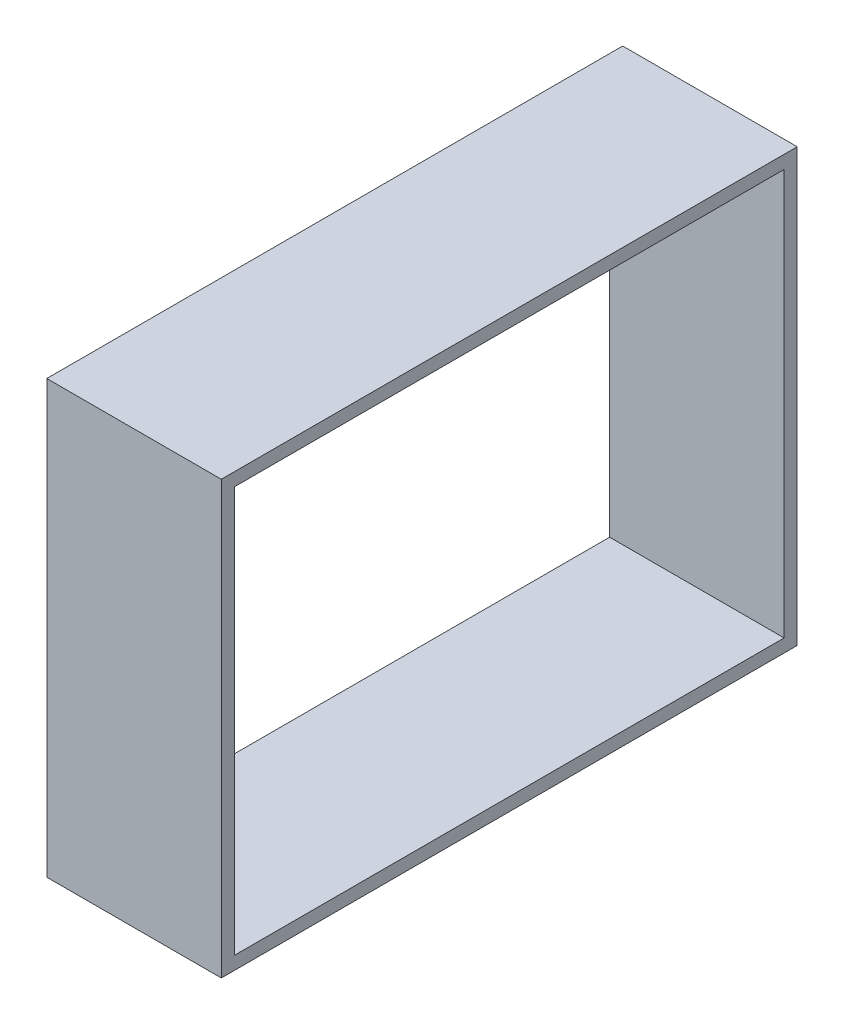
ISO-10303-21;
HEADER;
FILE_DESCRIPTION(('STEP AP214'),'2;1');
FILE_NAME('part.step','',(''),(''),'','','');
FILE_SCHEMA(('AUTOMOTIVE_DESIGN { 1 0 10303 214 1 1 1 1 }'));
ENDSEC;
DATA;
#1=APPLICATION_CONTEXT('core data for automotive mechanical design processes');
#2=APPLICATION_PROTOCOL_DEFINITION('international standard','automotive_design',2000,#1);
#3=PRODUCT_CONTEXT('',#1,'mechanical');
#4=PRODUCT('Part','Part','',(#3));
#5=PRODUCT_RELATED_PRODUCT_CATEGORY('part','',(#4));
#6=PRODUCT_DEFINITION_FORMATION('','',#4);
#7=PRODUCT_DEFINITION_CONTEXT('part definition',#1,'design');
#8=PRODUCT_DEFINITION('design','',#6,#7);
#9=PRODUCT_DEFINITION_SHAPE('','',#8);
#10=(LENGTH_UNIT() NAMED_UNIT(*) SI_UNIT(.MILLI.,.METRE.));
#11=(NAMED_UNIT(*) PLANE_ANGLE_UNIT() SI_UNIT($,.RADIAN.));
#12=(NAMED_UNIT(*) SI_UNIT($,.STERADIAN.) SOLID_ANGLE_UNIT());
#13=UNCERTAINTY_MEASURE_WITH_UNIT(LENGTH_MEASURE(1.E-05),#10,'distance_accuracy_value','');
#14=(GEOMETRIC_REPRESENTATION_CONTEXT(3) GLOBAL_UNCERTAINTY_ASSIGNED_CONTEXT((#13)) GLOBAL_UNIT_ASSIGNED_CONTEXT((#10,
#11,#12)) REPRESENTATION_CONTEXT('',''));
#15=CARTESIAN_POINT('',(0.,0.,0.));
#16=DIRECTION('',(0.,0.,1.));
#17=DIRECTION('',(1.,0.,0.));
#18=AXIS2_PLACEMENT_3D('',#15,#16,#17);
#19=CARTESIAN_POINT('',(-17.75,-24.75,35.5));
#20=DIRECTION('',(1.,0.,0.));
#21=DIRECTION('',(0.,1.,0.));
#22=AXIS2_PLACEMENT_3D('',#19,#20,#21);
#23=PLANE('',#22);
#24=DIRECTION('',(0.,-1.,0.));
#25=VECTOR('',#24,1.);
#26=CARTESIAN_POINT('',(-17.75,-24.,37.));
#27=LINE('',#26,#25);
#28=CARTESIAN_POINT('',(-17.75,23.25,37.));
#29=VERTEX_POINT('',#28);
#30=CARTESIAN_POINT('',(-17.75,-23.25,37.));
#31=VERTEX_POINT('',#30);
#32=EDGE_CURVE('E145',#29,#31,#27,.T.);
#33=ORIENTED_EDGE('',*,*,#32,.T.);
#34=DIRECTION('',(0.,0.,1.));
#35=VECTOR('',#34,1.);
#36=CARTESIAN_POINT('',(-17.75,-23.25,36.25));
#37=LINE('',#36,#35);
#38=CARTESIAN_POINT('',(-17.75,-23.25,100.));
#39=VERTEX_POINT('',#38);
#40=EDGE_CURVE('E9',#31,#39,#37,.T.);
#41=ORIENTED_EDGE('',*,*,#40,.T.);
#42=DIRECTION('',(0.,-1.,0.));
#43=VECTOR('',#42,1.);
#44=CARTESIAN_POINT('',(-17.75,-24.,100.));
#45=LINE('',#44,#43);
#46=CARTESIAN_POINT('',(-17.75,23.25,100.));
#47=VERTEX_POINT('',#46);
#48=EDGE_CURVE('E158',#47,#39,#45,.T.);
#49=ORIENTED_EDGE('',*,*,#48,.F.);
#50=DIRECTION('',(0.,0.,1.));
#51=VECTOR('',#50,1.);
#52=CARTESIAN_POINT('',(-17.75,23.25,36.25));
#53=LINE('',#52,#51);
#54=EDGE_CURVE('E18',#29,#47,#53,.T.);
#55=ORIENTED_EDGE('',*,*,#54,.F.);
#56=EDGE_LOOP('',(#33,#41,#49,#55));
#57=FACE_BOUND('',#56,.T.);
#58=DIRECTION('',(0.,0.,1.));
#59=VECTOR('',#58,1.);
#60=CARTESIAN_POINT('',(-17.75,-24.75,35.5));
#61=LINE('',#60,#59);
#62=CARTESIAN_POINT('',(-17.75,-24.75,35.5));
#63=VERTEX_POINT('',#62);
#64=CARTESIAN_POINT('',(-17.75,-24.75,101.5));
#65=VERTEX_POINT('',#64);
#66=EDGE_CURVE('E118',#63,#65,#61,.T.);
#67=ORIENTED_EDGE('',*,*,#66,.F.);
#68=DIRECTION('',(0.,1.,0.));
#69=VECTOR('',#68,1.);
#70=CARTESIAN_POINT('',(-17.75,-24.75,35.5));
#71=LINE('',#70,#69);
#72=CARTESIAN_POINT('',(-17.75,24.75,35.5));
#73=VERTEX_POINT('',#72);
#74=EDGE_CURVE('E114',#63,#73,#71,.T.);
#75=ORIENTED_EDGE('',*,*,#74,.T.);
#76=DIRECTION('',(0.,0.,1.));
#77=VECTOR('',#76,1.);
#78=CARTESIAN_POINT('',(-17.75,24.75,35.5));
#79=LINE('',#78,#77);
#80=CARTESIAN_POINT('',(-17.75,24.75,101.5));
#81=VERTEX_POINT('',#80);
#82=EDGE_CURVE('E102',#73,#81,#79,.T.);
#83=ORIENTED_EDGE('',*,*,#82,.T.);
#84=DIRECTION('',(0.,1.,0.));
#85=VECTOR('',#84,1.);
#86=CARTESIAN_POINT('',(-17.75,-24.75,101.5));
#87=LINE('',#86,#85);
#88=EDGE_CURVE('E134',#65,#81,#87,.T.);
#89=ORIENTED_EDGE('',*,*,#88,.F.);
#90=EDGE_LOOP('',(#67,#75,#83,#89));
#91=FACE_BOUND('',#90,.T.);
#92=ADVANCED_FACE('F14',(#57,#91),#23,.T.);
#93=CARTESIAN_POINT('',(-38.75,-23.25,37.));
#94=DIRECTION('',(0.,1.,0.));
#95=DIRECTION('',(1.,0.,0.));
#96=AXIS2_PLACEMENT_3D('',#93,#94,#95);
#97=PLANE('',#96);
#98=DIRECTION('',(1.,0.,0.));
#99=VECTOR('',#98,1.);
#100=CARTESIAN_POINT('',(-38.75,-23.25,37.));
#101=LINE('',#100,#99);
#102=CARTESIAN_POINT('',(-37.75,-23.25,37.));
#103=VERTEX_POINT('',#102);
#104=EDGE_CURVE('E91',#103,#31,#101,.T.);
#105=ORIENTED_EDGE('',*,*,#104,.F.);
#106=DIRECTION('',(0.,0.,1.));
#107=VECTOR('',#106,1.);
#108=CARTESIAN_POINT('',(-37.75,-23.25,36.25));
#109=LINE('',#108,#107);
#110=CARTESIAN_POINT('',(-37.75,-23.25,100.));
#111=VERTEX_POINT('',#110);
#112=EDGE_CURVE('E177',#103,#111,#109,.T.);
#113=ORIENTED_EDGE('',*,*,#112,.T.);
#114=DIRECTION('',(1.,0.,0.));
#115=VECTOR('',#114,1.);
#116=CARTESIAN_POINT('',(-38.75,-23.25,100.));
#117=LINE('',#116,#115);
#118=EDGE_CURVE('E25',#111,#39,#117,.T.);
#119=ORIENTED_EDGE('',*,*,#118,.T.);
#120=ORIENTED_EDGE('',*,*,#40,.F.);
#121=EDGE_LOOP('',(#105,#113,#119,#120));
#122=FACE_BOUND('',#121,.T.);
#123=ADVANCED_FACE('F16',(#122),#97,.T.);
#124=CARTESIAN_POINT('',(-38.75,-23.25,100.));
#125=DIRECTION('',(0.,0.,1.));
#126=DIRECTION('',(1.,0.,0.));
#127=AXIS2_PLACEMENT_3D('',#124,#125,#126);
#128=PLANE('',#127);
#129=ORIENTED_EDGE('',*,*,#48,.T.);
#130=ORIENTED_EDGE('',*,*,#118,.F.);
#131=DIRECTION('',(0.,-1.,0.));
#132=VECTOR('',#131,1.);
#133=CARTESIAN_POINT('',(-37.75,-24.,100.));
#134=LINE('',#133,#132);
#135=CARTESIAN_POINT('',(-37.75,23.25,100.));
#136=VERTEX_POINT('',#135);
#137=EDGE_CURVE('E174',#136,#111,#134,.T.);
#138=ORIENTED_EDGE('',*,*,#137,.F.);
#139=DIRECTION('',(1.,0.,0.));
#140=VECTOR('',#139,1.);
#141=CARTESIAN_POINT('',(-38.75,23.25,100.));
#142=LINE('',#141,#140);
#143=EDGE_CURVE('E151',#136,#47,#142,.T.);
#144=ORIENTED_EDGE('',*,*,#143,.T.);
#145=EDGE_LOOP('',(#129,#130,#138,#144));
#146=FACE_BOUND('',#145,.T.);
#147=ADVANCED_FACE('F215',(#146),#128,.F.);
#148=CARTESIAN_POINT('',(-38.75,23.25,37.));
#149=DIRECTION('',(0.,1.,0.));
#150=DIRECTION('',(1.,0.,0.));
#151=AXIS2_PLACEMENT_3D('',#148,#149,#150);
#152=PLANE('',#151);
#153=ORIENTED_EDGE('',*,*,#54,.T.);
#154=ORIENTED_EDGE('',*,*,#143,.F.);
#155=DIRECTION('',(0.,0.,1.));
#156=VECTOR('',#155,1.);
#157=CARTESIAN_POINT('',(-37.75,23.25,36.25));
#158=LINE('',#157,#156);
#159=CARTESIAN_POINT('',(-37.75,23.25,37.));
#160=VERTEX_POINT('',#159);
#161=EDGE_CURVE('E170',#160,#136,#158,.T.);
#162=ORIENTED_EDGE('',*,*,#161,.F.);
#163=DIRECTION('',(1.,0.,0.));
#164=VECTOR('',#163,1.);
#165=CARTESIAN_POINT('',(-38.75,23.25,37.));
#166=LINE('',#165,#164);
#167=EDGE_CURVE('E113',#160,#29,#166,.T.);
#168=ORIENTED_EDGE('',*,*,#167,.T.);
#169=EDGE_LOOP('',(#153,#154,#162,#168));
#170=FACE_BOUND('',#169,.T.);
#171=ADVANCED_FACE('F285',(#170),#152,.F.);
#172=CARTESIAN_POINT('',(-38.75,-23.25,37.));
#173=DIRECTION('',(0.,0.,1.));
#174=DIRECTION('',(1.,0.,0.));
#175=AXIS2_PLACEMENT_3D('',#172,#173,#174);
#176=PLANE('',#175);
#177=ORIENTED_EDGE('',*,*,#167,.F.);
#178=DIRECTION('',(0.,-1.,0.));
#179=VECTOR('',#178,1.);
#180=CARTESIAN_POINT('',(-37.75,-24.,37.));
#181=LINE('',#180,#179);
#182=EDGE_CURVE('E138',#160,#103,#181,.T.);
#183=ORIENTED_EDGE('',*,*,#182,.T.);
#184=ORIENTED_EDGE('',*,*,#104,.T.);
#185=ORIENTED_EDGE('',*,*,#32,.F.);
#186=EDGE_LOOP('',(#177,#183,#184,#185));
#187=FACE_BOUND('',#186,.T.);
#188=ADVANCED_FACE('F248',(#187),#176,.T.);
#189=CARTESIAN_POINT('',(-37.75,24.75,35.5));
#190=DIRECTION('',(0.,1.,0.));
#191=DIRECTION('',(1.,0.,0.));
#192=AXIS2_PLACEMENT_3D('',#189,#190,#191);
#193=PLANE('',#192);
#194=DIRECTION('',(1.,0.,0.));
#195=VECTOR('',#194,1.);
#196=CARTESIAN_POINT('',(-37.75,24.75,35.5));
#197=LINE('',#196,#195);
#198=CARTESIAN_POINT('',(-37.75,24.75,35.5));
#199=VERTEX_POINT('',#198);
#200=EDGE_CURVE('E107',#199,#73,#197,.T.);
#201=ORIENTED_EDGE('',*,*,#200,.F.);
#202=DIRECTION('',(0.,0.,1.));
#203=VECTOR('',#202,1.);
#204=CARTESIAN_POINT('',(-37.75,24.75,35.5));
#205=LINE('',#204,#203);
#206=CARTESIAN_POINT('',(-37.75,24.75,101.5));
#207=VERTEX_POINT('',#206);
#208=EDGE_CURVE('E181',#199,#207,#205,.T.);
#209=ORIENTED_EDGE('',*,*,#208,.T.);
#210=DIRECTION('',(1.,0.,0.));
#211=VECTOR('',#210,1.);
#212=CARTESIAN_POINT('',(-37.75,24.75,101.5));
#213=LINE('',#212,#211);
#214=EDGE_CURVE('E109',#207,#81,#213,.T.);
#215=ORIENTED_EDGE('',*,*,#214,.T.);
#216=ORIENTED_EDGE('',*,*,#82,.F.);
#217=EDGE_LOOP('',(#201,#209,#215,#216));
#218=FACE_BOUND('',#217,.T.);
#219=ADVANCED_FACE('F104',(#218),#193,.T.);
#220=CARTESIAN_POINT('',(-37.75,-24.75,35.5));
#221=DIRECTION('',(0.,0.,1.));
#222=DIRECTION('',(1.,0.,0.));
#223=AXIS2_PLACEMENT_3D('',#220,#221,#222);
#224=PLANE('',#223);
#225=ORIENTED_EDGE('',*,*,#200,.T.);
#226=ORIENTED_EDGE('',*,*,#74,.F.);
#227=DIRECTION('',(1.,0.,0.));
#228=VECTOR('',#227,1.);
#229=CARTESIAN_POINT('',(-37.75,-24.75,35.5));
#230=LINE('',#229,#228);
#231=CARTESIAN_POINT('',(-37.75,-24.75,35.5));
#232=VERTEX_POINT('',#231);
#233=EDGE_CURVE('E142',#232,#63,#230,.T.);
#234=ORIENTED_EDGE('',*,*,#233,.F.);
#235=DIRECTION('',(0.,1.,0.));
#236=VECTOR('',#235,1.);
#237=CARTESIAN_POINT('',(-37.75,-24.75,35.5));
#238=LINE('',#237,#236);
#239=EDGE_CURVE('E126',#232,#199,#238,.T.);
#240=ORIENTED_EDGE('',*,*,#239,.T.);
#241=EDGE_LOOP('',(#225,#226,#234,#240));
#242=FACE_BOUND('',#241,.T.);
#243=ADVANCED_FACE('F124',(#242),#224,.F.);
#244=CARTESIAN_POINT('',(-37.75,-24.75,101.5));
#245=DIRECTION('',(0.,0.,1.));
#246=DIRECTION('',(1.,0.,0.));
#247=AXIS2_PLACEMENT_3D('',#244,#245,#246);
#248=PLANE('',#247);
#249=DIRECTION('',(0.,1.,0.));
#250=VECTOR('',#249,1.);
#251=CARTESIAN_POINT('',(-37.75,-24.75,101.5));
#252=LINE('',#251,#250);
#253=CARTESIAN_POINT('',(-37.75,-24.75,101.5));
#254=VERTEX_POINT('',#253);
#255=EDGE_CURVE('E178',#254,#207,#252,.T.);
#256=ORIENTED_EDGE('',*,*,#255,.F.);
#257=DIRECTION('',(1.,0.,0.));
#258=VECTOR('',#257,1.);
#259=CARTESIAN_POINT('',(-37.75,-24.75,101.5));
#260=LINE('',#259,#258);
#261=EDGE_CURVE('E140',#254,#65,#260,.T.);
#262=ORIENTED_EDGE('',*,*,#261,.T.);
#263=ORIENTED_EDGE('',*,*,#88,.T.);
#264=ORIENTED_EDGE('',*,*,#214,.F.);
#265=EDGE_LOOP('',(#256,#262,#263,#264));
#266=FACE_BOUND('',#265,.T.);
#267=ADVANCED_FACE('F228',(#266),#248,.T.);
#268=CARTESIAN_POINT('',(-37.75,-24.75,35.5));
#269=DIRECTION('',(0.,1.,0.));
#270=DIRECTION('',(1.,0.,0.));
#271=AXIS2_PLACEMENT_3D('',#268,#269,#270);
#272=PLANE('',#271);
#273=ORIENTED_EDGE('',*,*,#66,.T.);
#274=ORIENTED_EDGE('',*,*,#261,.F.);
#275=DIRECTION('',(0.,0.,1.));
#276=VECTOR('',#275,1.);
#277=CARTESIAN_POINT('',(-37.75,-24.75,35.5));
#278=LINE('',#277,#276);
#279=EDGE_CURVE('E167',#232,#254,#278,.T.);
#280=ORIENTED_EDGE('',*,*,#279,.F.);
#281=ORIENTED_EDGE('',*,*,#233,.T.);
#282=EDGE_LOOP('',(#273,#274,#280,#281));
#283=FACE_BOUND('',#282,.T.);
#284=ADVANCED_FACE('F203',(#283),#272,.F.);
#285=CARTESIAN_POINT('',(-37.75,-24.75,35.5));
#286=DIRECTION('',(1.,0.,0.));
#287=DIRECTION('',(0.,1.,0.));
#288=AXIS2_PLACEMENT_3D('',#285,#286,#287);
#289=PLANE('',#288);
#290=ORIENTED_EDGE('',*,*,#161,.T.);
#291=ORIENTED_EDGE('',*,*,#137,.T.);
#292=ORIENTED_EDGE('',*,*,#112,.F.);
#293=ORIENTED_EDGE('',*,*,#182,.F.);
#294=EDGE_LOOP('',(#290,#291,#292,#293));
#295=FACE_BOUND('',#294,.T.);
#296=ORIENTED_EDGE('',*,*,#255,.T.);
#297=ORIENTED_EDGE('',*,*,#208,.F.);
#298=ORIENTED_EDGE('',*,*,#239,.F.);
#299=ORIENTED_EDGE('',*,*,#279,.T.);
#300=EDGE_LOOP('',(#296,#297,#298,#299));
#301=FACE_BOUND('',#300,.T.);
#302=ADVANCED_FACE('F258',(#295,#301),#289,.F.);
#303=CLOSED_SHELL('',(#92,#123,#147,#171,#188,#219,#243,#267,#284,#302));
#304=MANIFOLD_SOLID_BREP('B1',#303);
#305=ADVANCED_BREP_SHAPE_REPRESENTATION('',(#18,#304),#14);
#306=SHAPE_DEFINITION_REPRESENTATION(#9,#305);
ENDSEC;
END-ISO-10303-21;
